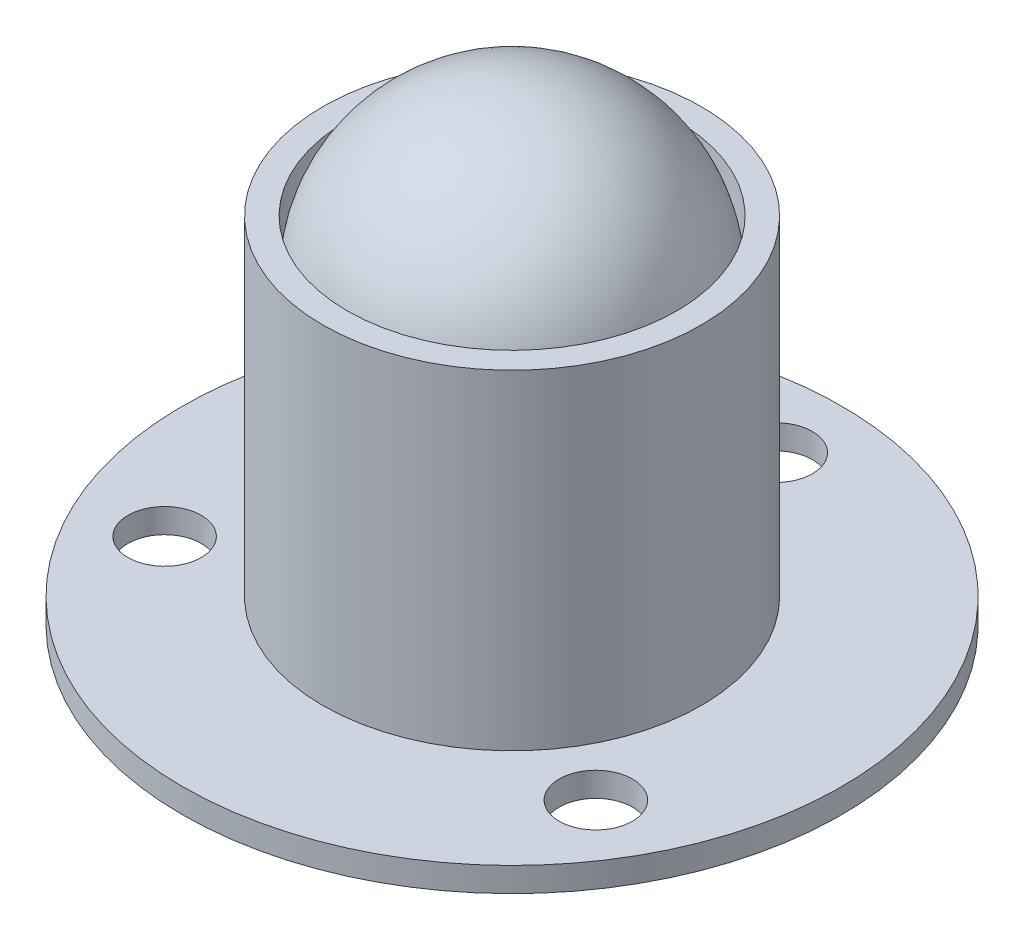
ISO-10303-21;
HEADER;
FILE_DESCRIPTION(('STEP AP214'),'2;1');
FILE_NAME('part.step','',(''),(''),'','','');
FILE_SCHEMA(('AUTOMOTIVE_DESIGN { 1 0 10303 214 1 1 1 1 }'));
ENDSEC;
DATA;
#1=APPLICATION_CONTEXT('core data for automotive mechanical design processes');
#2=APPLICATION_PROTOCOL_DEFINITION('international standard','automotive_design',2000,#1);
#3=PRODUCT_CONTEXT('',#1,'mechanical');
#4=PRODUCT('Part','Part','',(#3));
#5=PRODUCT_RELATED_PRODUCT_CATEGORY('part','',(#4));
#6=PRODUCT_DEFINITION_FORMATION('','',#4);
#7=PRODUCT_DEFINITION_CONTEXT('part definition',#1,'design');
#8=PRODUCT_DEFINITION('design','',#6,#7);
#9=PRODUCT_DEFINITION_SHAPE('','',#8);
#10=(LENGTH_UNIT() NAMED_UNIT(*) SI_UNIT(.MILLI.,.METRE.));
#11=(NAMED_UNIT(*) PLANE_ANGLE_UNIT() SI_UNIT($,.RADIAN.));
#12=(NAMED_UNIT(*) SI_UNIT($,.STERADIAN.) SOLID_ANGLE_UNIT());
#13=UNCERTAINTY_MEASURE_WITH_UNIT(LENGTH_MEASURE(1.E-05),#10,'distance_accuracy_value','');
#14=(GEOMETRIC_REPRESENTATION_CONTEXT(3) GLOBAL_UNCERTAINTY_ASSIGNED_CONTEXT((#13)) GLOBAL_UNIT_ASSIGNED_CONTEXT((#10,
#11,#12)) REPRESENTATION_CONTEXT('',''));
#15=CARTESIAN_POINT('',(0.,0.,0.));
#16=DIRECTION('',(0.,0.,1.));
#17=DIRECTION('',(1.,0.,0.));
#18=AXIS2_PLACEMENT_3D('',#15,#16,#17);
#19=CARTESIAN_POINT('',(0.,12.25,0.));
#20=DIRECTION('',(0.,0.,-1.));
#21=DIRECTION('',(1.,0.,0.));
#22=AXIS2_PLACEMENT_3D('',#19,#20,#21);
#23=SPHERICAL_SURFACE('',#22,6.75);
#24=CARTESIAN_POINT('',(0.,12.25,-6.75));
#25=VERTEX_POINT('',#24);
#26=VERTEX_LOOP('',#25);
#27=FACE_BOUND('',#26,.T.);
#28=ADVANCED_FACE('F45',(#27),#23,.T.);
#29=CLOSED_SHELL('',(#28));
#30=MANIFOLD_SOLID_BREP('B2',#29);
#31=CARTESIAN_POINT('',(0.,1.,0.));
#32=DIRECTION('',(0.,-1.,0.));
#33=DIRECTION('',(0.,0.,-1.));
#34=AXIS2_PLACEMENT_3D('',#31,#32,#33);
#35=CYLINDRICAL_SURFACE('',#34,13.5);
#36=CARTESIAN_POINT('',(0.,1.,0.));
#37=DIRECTION('',(0.,1.,0.));
#38=DIRECTION('',(0.,0.,1.));
#39=AXIS2_PLACEMENT_3D('',#36,#37,#38);
#40=CIRCLE('',#39,13.5);
#41=CARTESIAN_POINT('',(0.,1.,13.5));
#42=VERTEX_POINT('',#41);
#43=EDGE_CURVE('E67',#42,#42,#40,.T.);
#44=ORIENTED_EDGE('',*,*,#43,.F.);
#45=EDGE_LOOP('',(#44));
#46=FACE_BOUND('',#45,.T.);
#47=CARTESIAN_POINT('',(0.,0.,0.));
#48=DIRECTION('',(0.,1.,0.));
#49=DIRECTION('',(0.,0.,1.));
#50=AXIS2_PLACEMENT_3D('',#47,#48,#49);
#51=CIRCLE('',#50,13.5);
#52=CARTESIAN_POINT('',(0.,0.,13.5));
#53=VERTEX_POINT('',#52);
#54=EDGE_CURVE('E72',#53,#53,#51,.T.);
#55=ORIENTED_EDGE('',*,*,#54,.T.);
#56=EDGE_LOOP('',(#55));
#57=FACE_BOUND('',#56,.T.);
#58=ADVANCED_FACE('F60',(#46,#57),#35,.T.);
#59=CARTESIAN_POINT('',(0.,1.,0.));
#60=DIRECTION('',(0.,1.,0.));
#61=DIRECTION('',(0.,0.,1.));
#62=AXIS2_PLACEMENT_3D('',#59,#60,#61);
#63=PLANE('',#62);
#64=CARTESIAN_POINT('',(-9.24388007725362,1.,4.98913004712302));
#65=DIRECTION('',(0.,1.,0.));
#66=DIRECTION('',(0.866025403784436,0.,-0.500000000000004));
#67=AXIS2_PLACEMENT_3D('',#64,#65,#66);
#68=CIRCLE('',#67,1.5);
#69=CARTESIAN_POINT('',(-7.94484197157697,1.,4.23913004712301));
#70=VERTEX_POINT('',#69);
#71=EDGE_CURVE('E98',#70,#70,#68,.T.);
#72=ORIENTED_EDGE('',*,*,#71,.F.);
#73=EDGE_LOOP('',(#72));
#74=FACE_BOUND('',#73,.T.);
#75=CARTESIAN_POINT('',(8.94265340221962,1.,5.51086995287694));
#76=DIRECTION('',(0.,1.,0.));
#77=DIRECTION('',(-0.866025403784443,0.,-0.499999999999992));
#78=AXIS2_PLACEMENT_3D('',#75,#76,#77);
#79=CIRCLE('',#78,1.5);
#80=CARTESIAN_POINT('',(7.64361529654296,1.,4.76086995287696));
#81=VERTEX_POINT('',#80);
#82=EDGE_CURVE('E99',#81,#81,#79,.T.);
#83=ORIENTED_EDGE('',*,*,#82,.F.);
#84=EDGE_LOOP('',(#83));
#85=FACE_BOUND('',#84,.T.);
#86=CARTESIAN_POINT('',(0.301226675034072,1.,-10.5));
#87=DIRECTION('',(0.,1.,0.));
#88=DIRECTION('',(0.,0.,1.));
#89=AXIS2_PLACEMENT_3D('',#86,#87,#88);
#90=CIRCLE('',#89,1.5);
#91=CARTESIAN_POINT('',(0.301226675034072,1.,-9.));
#92=VERTEX_POINT('',#91);
#93=EDGE_CURVE('E91',#92,#92,#90,.T.);
#94=ORIENTED_EDGE('',*,*,#93,.F.);
#95=EDGE_LOOP('',(#94));
#96=FACE_BOUND('',#95,.T.);
#97=CARTESIAN_POINT('',(0.,1.,0.));
#98=DIRECTION('',(0.,1.,0.));
#99=DIRECTION('',(0.,0.,1.));
#100=AXIS2_PLACEMENT_3D('',#97,#98,#99);
#101=CIRCLE('',#100,7.75);
#102=CARTESIAN_POINT('',(0.,1.,7.75));
#103=VERTEX_POINT('',#102);
#104=EDGE_CURVE('E44',#103,#103,#101,.T.);
#105=ORIENTED_EDGE('',*,*,#104,.F.);
#106=EDGE_LOOP('',(#105));
#107=FACE_BOUND('',#106,.T.);
#108=ORIENTED_EDGE('',*,*,#43,.T.);
#109=EDGE_LOOP('',(#108));
#110=FACE_BOUND('',#109,.T.);
#111=ADVANCED_FACE('F110',(#74,#85,#96,#107,#110),#63,.T.);
#112=CARTESIAN_POINT('',(0.,0.,0.));
#113=DIRECTION('',(0.,1.,0.));
#114=DIRECTION('',(0.,0.,1.));
#115=AXIS2_PLACEMENT_3D('',#112,#113,#114);
#116=PLANE('',#115);
#117=CARTESIAN_POINT('',(-9.24388007725362,0.,4.98913004712302));
#118=DIRECTION('',(0.,1.,0.));
#119=DIRECTION('',(0.866025403784436,0.,-0.500000000000004));
#120=AXIS2_PLACEMENT_3D('',#117,#118,#119);
#121=CIRCLE('',#120,1.5);
#122=CARTESIAN_POINT('',(-7.94484197157697,0.,4.23913004712301));
#123=VERTEX_POINT('',#122);
#124=EDGE_CURVE('E94',#123,#123,#121,.T.);
#125=ORIENTED_EDGE('',*,*,#124,.T.);
#126=EDGE_LOOP('',(#125));
#127=FACE_BOUND('',#126,.T.);
#128=CARTESIAN_POINT('',(8.94265340221962,0.,5.51086995287694));
#129=DIRECTION('',(0.,1.,0.));
#130=DIRECTION('',(-0.866025403784443,0.,-0.499999999999992));
#131=AXIS2_PLACEMENT_3D('',#128,#129,#130);
#132=CIRCLE('',#131,1.5);
#133=CARTESIAN_POINT('',(7.64361529654296,0.,4.76086995287696));
#134=VERTEX_POINT('',#133);
#135=EDGE_CURVE('E95',#134,#134,#132,.T.);
#136=ORIENTED_EDGE('',*,*,#135,.T.);
#137=EDGE_LOOP('',(#136));
#138=FACE_BOUND('',#137,.T.);
#139=CARTESIAN_POINT('',(0.301226675034072,0.,-10.5));
#140=DIRECTION('',(0.,1.,0.));
#141=DIRECTION('',(0.,0.,1.));
#142=AXIS2_PLACEMENT_3D('',#139,#140,#141);
#143=CIRCLE('',#142,1.5);
#144=CARTESIAN_POINT('',(0.301226675034072,0.,-9.));
#145=VERTEX_POINT('',#144);
#146=EDGE_CURVE('E63',#145,#145,#143,.T.);
#147=ORIENTED_EDGE('',*,*,#146,.T.);
#148=EDGE_LOOP('',(#147));
#149=FACE_BOUND('',#148,.T.);
#150=ORIENTED_EDGE('',*,*,#54,.F.);
#151=EDGE_LOOP('',(#150));
#152=FACE_BOUND('',#151,.T.);
#153=ADVANCED_FACE('F113',(#127,#138,#149,#152),#116,.F.);
#154=CARTESIAN_POINT('',(0.,14.5,0.));
#155=DIRECTION('',(0.,-1.,0.));
#156=DIRECTION('',(0.,0.,-1.));
#157=AXIS2_PLACEMENT_3D('',#154,#155,#156);
#158=CYLINDRICAL_SURFACE('',#157,7.75);
#159=CARTESIAN_POINT('',(0.,14.5,0.));
#160=DIRECTION('',(0.,1.,0.));
#161=DIRECTION('',(0.,0.,1.));
#162=AXIS2_PLACEMENT_3D('',#159,#160,#161);
#163=CIRCLE('',#162,7.75);
#164=CARTESIAN_POINT('',(0.,14.5,7.75));
#165=VERTEX_POINT('',#164);
#166=EDGE_CURVE('E75',#165,#165,#163,.T.);
#167=ORIENTED_EDGE('',*,*,#166,.F.);
#168=EDGE_LOOP('',(#167));
#169=FACE_BOUND('',#168,.T.);
#170=ORIENTED_EDGE('',*,*,#104,.T.);
#171=EDGE_LOOP('',(#170));
#172=FACE_BOUND('',#171,.T.);
#173=ADVANCED_FACE('F137',(#169,#172),#158,.T.);
#174=CARTESIAN_POINT('',(0.,14.5,0.));
#175=DIRECTION('',(0.,1.,0.));
#176=DIRECTION('',(0.,0.,1.));
#177=AXIS2_PLACEMENT_3D('',#174,#175,#176);
#178=PLANE('',#177);
#179=CARTESIAN_POINT('',(0.,14.5,0.));
#180=DIRECTION('',(0.,1.,0.));
#181=DIRECTION('',(0.,0.,1.));
#182=AXIS2_PLACEMENT_3D('',#179,#180,#181);
#183=CIRCLE('',#182,6.75);
#184=CARTESIAN_POINT('',(0.,14.5,6.75));
#185=VERTEX_POINT('',#184);
#186=EDGE_CURVE('E85',#185,#185,#183,.T.);
#187=ORIENTED_EDGE('',*,*,#186,.F.);
#188=EDGE_LOOP('',(#187));
#189=FACE_BOUND('',#188,.T.);
#190=ORIENTED_EDGE('',*,*,#166,.T.);
#191=EDGE_LOOP('',(#190));
#192=FACE_BOUND('',#191,.T.);
#193=ADVANCED_FACE('F144',(#189,#192),#178,.T.);
#194=CARTESIAN_POINT('',(0.,1.,0.));
#195=DIRECTION('',(0.,1.,0.));
#196=DIRECTION('',(0.,0.,1.));
#197=AXIS2_PLACEMENT_3D('',#194,#195,#196);
#198=PLANE('',#197);
#199=CARTESIAN_POINT('',(0.,1.,0.));
#200=DIRECTION('',(0.,1.,0.));
#201=DIRECTION('',(0.,0.,1.));
#202=AXIS2_PLACEMENT_3D('',#199,#200,#201);
#203=CIRCLE('',#202,6.75);
#204=CARTESIAN_POINT('',(0.,1.,6.75));
#205=VERTEX_POINT('',#204);
#206=EDGE_CURVE('E81',#205,#205,#203,.F.);
#207=ORIENTED_EDGE('',*,*,#206,.F.);
#208=EDGE_LOOP('',(#207));
#209=FACE_BOUND('',#208,.T.);
#210=ADVANCED_FACE('F152',(#209),#198,.T.);
#211=CARTESIAN_POINT('',(0.,14.5,0.));
#212=DIRECTION('',(0.,-1.,0.));
#213=DIRECTION('',(0.,0.,-1.));
#214=AXIS2_PLACEMENT_3D('',#211,#212,#213);
#215=CYLINDRICAL_SURFACE('',#214,6.75);
#216=ORIENTED_EDGE('',*,*,#206,.T.);
#217=EDGE_LOOP('',(#216));
#218=FACE_BOUND('',#217,.T.);
#219=ORIENTED_EDGE('',*,*,#186,.T.);
#220=EDGE_LOOP('',(#219));
#221=FACE_BOUND('',#220,.T.);
#222=ADVANCED_FACE('F160',(#218,#221),#215,.F.);
#223=CARTESIAN_POINT('',(0.301226675034072,-12.5,-10.5));
#224=DIRECTION('',(0.,1.,0.));
#225=DIRECTION('',(0.,0.,1.));
#226=AXIS2_PLACEMENT_3D('',#223,#224,#225);
#227=CYLINDRICAL_SURFACE('',#226,1.5);
#228=ORIENTED_EDGE('',*,*,#93,.T.);
#229=EDGE_LOOP('',(#228));
#230=FACE_BOUND('',#229,.T.);
#231=ORIENTED_EDGE('',*,*,#146,.F.);
#232=EDGE_LOOP('',(#231));
#233=FACE_BOUND('',#232,.T.);
#234=ADVANCED_FACE('F168',(#230,#233),#227,.F.);
#235=CARTESIAN_POINT('',(8.94265340221962,-12.5,5.51086995287694));
#236=DIRECTION('',(0.,1.,0.));
#237=DIRECTION('',(-0.866025403784443,0.,-0.499999999999992));
#238=AXIS2_PLACEMENT_3D('',#235,#236,#237);
#239=CYLINDRICAL_SURFACE('',#238,1.5);
#240=ORIENTED_EDGE('',*,*,#82,.T.);
#241=EDGE_LOOP('',(#240));
#242=FACE_BOUND('',#241,.T.);
#243=ORIENTED_EDGE('',*,*,#135,.F.);
#244=EDGE_LOOP('',(#243));
#245=FACE_BOUND('',#244,.T.);
#246=ADVANCED_FACE('F174',(#242,#245),#239,.F.);
#247=CARTESIAN_POINT('',(-9.24388007725362,-12.5,4.98913004712302));
#248=DIRECTION('',(0.,1.,0.));
#249=DIRECTION('',(0.866025403784436,0.,-0.500000000000004));
#250=AXIS2_PLACEMENT_3D('',#247,#248,#249);
#251=CYLINDRICAL_SURFACE('',#250,1.5);
#252=ORIENTED_EDGE('',*,*,#71,.T.);
#253=EDGE_LOOP('',(#252));
#254=FACE_BOUND('',#253,.T.);
#255=ORIENTED_EDGE('',*,*,#124,.F.);
#256=EDGE_LOOP('',(#255));
#257=FACE_BOUND('',#256,.T.);
#258=ADVANCED_FACE('F107',(#254,#257),#251,.F.);
#259=CLOSED_SHELL('',(#58,#111,#153,#173,#193,#210,#222,#234,#246,#258));
#260=MANIFOLD_SOLID_BREP('B6',#259);
#261=ADVANCED_BREP_SHAPE_REPRESENTATION('',(#18,#30,#260),#14);
#262=SHAPE_DEFINITION_REPRESENTATION(#9,#261);
ENDSEC;
END-ISO-10303-21;
